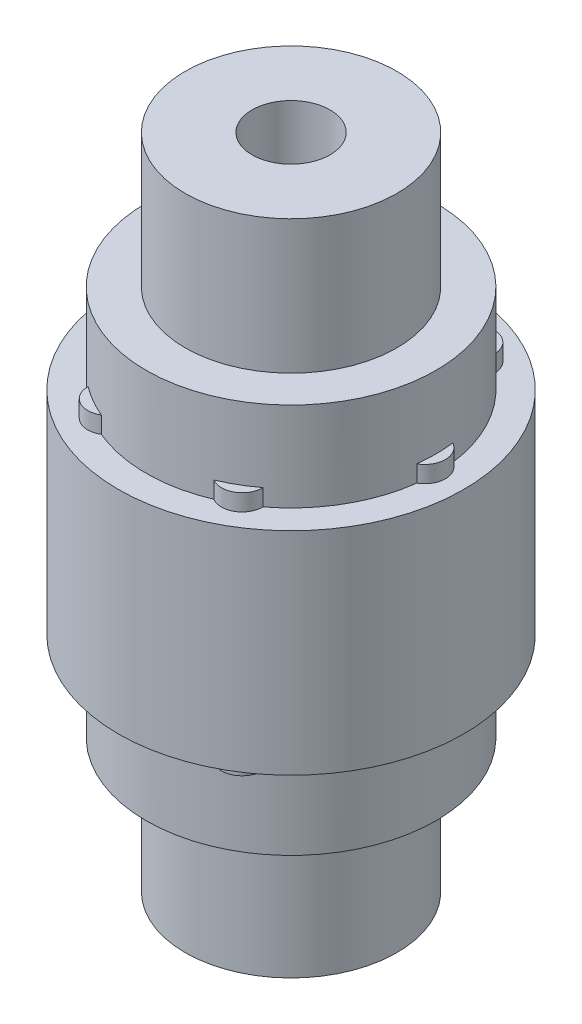
ISO-10303-21;
HEADER;
FILE_DESCRIPTION(('STEP AP214'),'2;1');
FILE_NAME('part.step','',(''),(''),'','','');
FILE_SCHEMA(('AUTOMOTIVE_DESIGN { 1 0 10303 214 1 1 1 1 }'));
ENDSEC;
DATA;
#1=APPLICATION_CONTEXT('core data for automotive mechanical design processes');
#2=APPLICATION_PROTOCOL_DEFINITION('international standard','automotive_design',2000,#1);
#3=PRODUCT_CONTEXT('',#1,'mechanical');
#4=PRODUCT('Part','Part','',(#3));
#5=PRODUCT_RELATED_PRODUCT_CATEGORY('part','',(#4));
#6=PRODUCT_DEFINITION_FORMATION('','',#4);
#7=PRODUCT_DEFINITION_CONTEXT('part definition',#1,'design');
#8=PRODUCT_DEFINITION('design','',#6,#7);
#9=PRODUCT_DEFINITION_SHAPE('','',#8);
#10=(LENGTH_UNIT() NAMED_UNIT(*) SI_UNIT(.MILLI.,.METRE.));
#11=(NAMED_UNIT(*) PLANE_ANGLE_UNIT() SI_UNIT($,.RADIAN.));
#12=(NAMED_UNIT(*) SI_UNIT($,.STERADIAN.) SOLID_ANGLE_UNIT());
#13=UNCERTAINTY_MEASURE_WITH_UNIT(LENGTH_MEASURE(1.E-05),#10,'distance_accuracy_value','');
#14=(GEOMETRIC_REPRESENTATION_CONTEXT(3) GLOBAL_UNCERTAINTY_ASSIGNED_CONTEXT((#13)) GLOBAL_UNIT_ASSIGNED_CONTEXT((#10,
#11,#12)) REPRESENTATION_CONTEXT('',''));
#15=CARTESIAN_POINT('',(0.,0.,0.));
#16=DIRECTION('',(0.,0.,1.));
#17=DIRECTION('',(1.,0.,0.));
#18=AXIS2_PLACEMENT_3D('',#15,#16,#17);
#19=CARTESIAN_POINT('',(0.,35.,0.));
#20=DIRECTION('',(0.,-1.,0.));
#21=DIRECTION('',(0.,0.,-1.));
#22=AXIS2_PLACEMENT_3D('',#19,#20,#21);
#23=CYLINDRICAL_SURFACE('',#22,26.);
#24=CARTESIAN_POINT('',(0.,-35.,0.));
#25=DIRECTION('',(0.,1.,0.));
#26=DIRECTION('',(0.,0.,1.));
#27=AXIS2_PLACEMENT_3D('',#24,#25,#26);
#28=CIRCLE('',#27,26.);
#29=CARTESIAN_POINT('',(0.,-35.,26.));
#30=VERTEX_POINT('',#29);
#31=EDGE_CURVE('E300',#30,#30,#28,.T.);
#32=ORIENTED_EDGE('',*,*,#31,.T.);
#33=EDGE_LOOP('',(#32));
#34=FACE_BOUND('',#33,.T.);
#35=DIRECTION('',(0.,-1.,0.));
#36=VECTOR('',#35,1.);
#37=CARTESIAN_POINT('',(10.0986054188646,0.,23.9586762696539));
#38=LINE('',#37,#36);
#39=CARTESIAN_POINT('',(10.0986054188646,-19.,23.9586762696539));
#40=VERTEX_POINT('',#39);
#41=CARTESIAN_POINT('',(10.0986054188646,-22.,23.9586762696539));
#42=VERTEX_POINT('',#41);
#43=EDGE_CURVE('E401',#40,#42,#38,.T.);
#44=ORIENTED_EDGE('',*,*,#43,.F.);
#45=CARTESIAN_POINT('',(0.,-19.,0.));
#46=DIRECTION('',(0.,1.,0.));
#47=DIRECTION('',(0.,0.,1.));
#48=AXIS2_PLACEMENT_3D('',#45,#46,#47);
#49=CIRCLE('',#48,26.);
#50=CARTESIAN_POINT('',(-10.0986054188647,-19.,23.9586762696539));
#51=VERTEX_POINT('',#50);
#52=EDGE_CURVE('E278',#40,#51,#49,.F.);
#53=ORIENTED_EDGE('',*,*,#52,.T.);
#54=DIRECTION('',(0.,-1.,0.));
#55=VECTOR('',#54,1.);
#56=CARTESIAN_POINT('',(-10.0986054188646,0.,23.9586762696539));
#57=LINE('',#56,#55);
#58=CARTESIAN_POINT('',(-10.0986054188646,-22.,23.9586762696539));
#59=VERTEX_POINT('',#58);
#60=EDGE_CURVE('E390',#59,#51,#57,.F.);
#61=ORIENTED_EDGE('',*,*,#60,.F.);
#62=CARTESIAN_POINT('',(0.,-22.,0.));
#63=DIRECTION('',(0.,1.,0.));
#64=DIRECTION('',(0.,0.,1.));
#65=AXIS2_PLACEMENT_3D('',#62,#63,#64);
#66=CIRCLE('',#65,26.);
#67=CARTESIAN_POINT('',(-15.6995195811354,-22.,20.7249869703589));
#68=VERTEX_POINT('',#67);
#69=EDGE_CURVE('E219',#68,#59,#66,.T.);
#70=ORIENTED_EDGE('',*,*,#69,.F.);
#71=DIRECTION('',(0.,-1.,0.));
#72=VECTOR('',#71,1.);
#73=CARTESIAN_POINT('',(-15.6995195811354,0.,20.7249869703589));
#74=LINE('',#73,#72);
#75=CARTESIAN_POINT('',(-15.6995195811354,-19.,20.7249869703589));
#76=VERTEX_POINT('',#75);
#77=EDGE_CURVE('E387',#76,#68,#74,.T.);
#78=ORIENTED_EDGE('',*,*,#77,.F.);
#79=CARTESIAN_POINT('',(-25.798125,-19.,3.23368929929499));
#80=VERTEX_POINT('',#79);
#81=EDGE_CURVE('E792',#76,#80,#49,.F.);
#82=ORIENTED_EDGE('',*,*,#81,.T.);
#83=DIRECTION('',(0.,-1.,0.));
#84=VECTOR('',#83,1.);
#85=CARTESIAN_POINT('',(-25.798125,0.,3.233689299295));
#86=LINE('',#85,#84);
#87=CARTESIAN_POINT('',(-25.798125,-22.,3.233689299295));
#88=VERTEX_POINT('',#87);
#89=EDGE_CURVE('E371',#88,#80,#86,.F.);
#90=ORIENTED_EDGE('',*,*,#89,.F.);
#91=CARTESIAN_POINT('',(0.,-22.,0.));
#92=DIRECTION('',(0.,1.,0.));
#93=DIRECTION('',(0.,0.,1.));
#94=AXIS2_PLACEMENT_3D('',#91,#92,#93);
#95=CIRCLE('',#94,26.);
#96=CARTESIAN_POINT('',(-25.798125,-22.,-3.233689299295));
#97=VERTEX_POINT('',#96);
#98=EDGE_CURVE('E230',#97,#88,#95,.T.);
#99=ORIENTED_EDGE('',*,*,#98,.F.);
#100=DIRECTION('',(0.,-1.,0.));
#101=VECTOR('',#100,1.);
#102=CARTESIAN_POINT('',(-25.798125,0.,-3.233689299295));
#103=LINE('',#102,#101);
#104=CARTESIAN_POINT('',(-25.798125,-19.,-3.23368929929499));
#105=VERTEX_POINT('',#104);
#106=EDGE_CURVE('E368',#105,#97,#103,.T.);
#107=ORIENTED_EDGE('',*,*,#106,.F.);
#108=CARTESIAN_POINT('',(-15.6995195811354,-19.,-20.7249869703589));
#109=VERTEX_POINT('',#108);
#110=EDGE_CURVE('E794',#105,#109,#49,.F.);
#111=ORIENTED_EDGE('',*,*,#110,.T.);
#112=DIRECTION('',(0.,-1.,0.));
#113=VECTOR('',#112,1.);
#114=CARTESIAN_POINT('',(-15.6995195811354,0.,-20.7249869703589));
#115=LINE('',#114,#113);
#116=CARTESIAN_POINT('',(-15.6995195811354,-22.,-20.7249869703589));
#117=VERTEX_POINT('',#116);
#118=EDGE_CURVE('E352',#117,#109,#115,.F.);
#119=ORIENTED_EDGE('',*,*,#118,.F.);
#120=CARTESIAN_POINT('',(0.,-22.,0.));
#121=DIRECTION('',(0.,1.,0.));
#122=DIRECTION('',(0.,0.,1.));
#123=AXIS2_PLACEMENT_3D('',#120,#121,#122);
#124=CIRCLE('',#123,26.);
#125=CARTESIAN_POINT('',(-10.0986054188646,-22.,-23.9586762696539));
#126=VERTEX_POINT('',#125);
#127=EDGE_CURVE('E239',#126,#117,#124,.T.);
#128=ORIENTED_EDGE('',*,*,#127,.F.);
#129=DIRECTION('',(0.,-1.,0.));
#130=VECTOR('',#129,1.);
#131=CARTESIAN_POINT('',(-10.0986054188646,0.,-23.9586762696539));
#132=LINE('',#131,#130);
#133=CARTESIAN_POINT('',(-10.0986054188646,-19.,-23.9586762696539));
#134=VERTEX_POINT('',#133);
#135=EDGE_CURVE('E349',#134,#126,#132,.T.);
#136=ORIENTED_EDGE('',*,*,#135,.F.);
#137=CARTESIAN_POINT('',(10.0986054188646,-19.,-23.9586762696539));
#138=VERTEX_POINT('',#137);
#139=EDGE_CURVE('E795',#134,#138,#49,.F.);
#140=ORIENTED_EDGE('',*,*,#139,.T.);
#141=DIRECTION('',(0.,-1.,0.));
#142=VECTOR('',#141,1.);
#143=CARTESIAN_POINT('',(10.0986054188646,0.,-23.9586762696539));
#144=LINE('',#143,#142);
#145=CARTESIAN_POINT('',(10.0986054188646,-22.,-23.9586762696539));
#146=VERTEX_POINT('',#145);
#147=EDGE_CURVE('E333',#146,#138,#144,.F.);
#148=ORIENTED_EDGE('',*,*,#147,.F.);
#149=CARTESIAN_POINT('',(0.,-22.,0.));
#150=DIRECTION('',(0.,1.,0.));
#151=DIRECTION('',(0.,0.,1.));
#152=AXIS2_PLACEMENT_3D('',#149,#150,#151);
#153=CIRCLE('',#152,26.);
#154=CARTESIAN_POINT('',(15.6995195811354,-22.,-20.7249869703589));
#155=VERTEX_POINT('',#154);
#156=EDGE_CURVE('E248',#155,#146,#153,.T.);
#157=ORIENTED_EDGE('',*,*,#156,.F.);
#158=DIRECTION('',(0.,-1.,0.));
#159=VECTOR('',#158,1.);
#160=CARTESIAN_POINT('',(15.6995195811354,0.,-20.7249869703589));
#161=LINE('',#160,#159);
#162=CARTESIAN_POINT('',(15.6995195811354,-19.,-20.7249869703589));
#163=VERTEX_POINT('',#162);
#164=EDGE_CURVE('E330',#163,#155,#161,.T.);
#165=ORIENTED_EDGE('',*,*,#164,.F.);
#166=CARTESIAN_POINT('',(25.798125,-19.,-3.23368929929499));
#167=VERTEX_POINT('',#166);
#168=EDGE_CURVE('E279',#163,#167,#49,.F.);
#169=ORIENTED_EDGE('',*,*,#168,.T.);
#170=DIRECTION('',(0.,-1.,0.));
#171=VECTOR('',#170,1.);
#172=CARTESIAN_POINT('',(25.798125,0.,-3.233689299295));
#173=LINE('',#172,#171);
#174=CARTESIAN_POINT('',(25.798125,-22.,-3.233689299295));
#175=VERTEX_POINT('',#174);
#176=EDGE_CURVE('E309',#175,#167,#173,.F.);
#177=ORIENTED_EDGE('',*,*,#176,.F.);
#178=CARTESIAN_POINT('',(0.,-22.,0.));
#179=DIRECTION('',(0.,1.,0.));
#180=DIRECTION('',(0.,0.,1.));
#181=AXIS2_PLACEMENT_3D('',#178,#179,#180);
#182=CIRCLE('',#181,26.);
#183=CARTESIAN_POINT('',(25.798125,-22.,3.233689299295));
#184=VERTEX_POINT('',#183);
#185=EDGE_CURVE('E257',#184,#175,#182,.T.);
#186=ORIENTED_EDGE('',*,*,#185,.F.);
#187=DIRECTION('',(0.,-1.,0.));
#188=VECTOR('',#187,1.);
#189=CARTESIAN_POINT('',(25.798125,0.,3.233689299295));
#190=LINE('',#189,#188);
#191=CARTESIAN_POINT('',(25.798125,-19.,3.23368929929499));
#192=VERTEX_POINT('',#191);
#193=EDGE_CURVE('E304',#192,#184,#190,.T.);
#194=ORIENTED_EDGE('',*,*,#193,.F.);
#195=CARTESIAN_POINT('',(15.6995195811354,-19.,20.7249869703589));
#196=VERTEX_POINT('',#195);
#197=EDGE_CURVE('E271',#192,#196,#49,.F.);
#198=ORIENTED_EDGE('',*,*,#197,.T.);
#199=DIRECTION('',(0.,-1.,0.));
#200=VECTOR('',#199,1.);
#201=CARTESIAN_POINT('',(15.6995195811354,0.,20.7249869703589));
#202=LINE('',#201,#200);
#203=CARTESIAN_POINT('',(15.6995195811354,-22.,20.7249869703589));
#204=VERTEX_POINT('',#203);
#205=EDGE_CURVE('E54',#204,#196,#202,.F.);
#206=ORIENTED_EDGE('',*,*,#205,.F.);
#207=CARTESIAN_POINT('',(0.,-22.,0.));
#208=DIRECTION('',(0.,1.,0.));
#209=DIRECTION('',(0.,0.,1.));
#210=AXIS2_PLACEMENT_3D('',#207,#208,#209);
#211=CIRCLE('',#210,26.);
#212=EDGE_CURVE('E11',#42,#204,#211,.T.);
#213=ORIENTED_EDGE('',*,*,#212,.F.);
#214=EDGE_LOOP('',(#44,#53,#61,#70,#78,#82,#90,#99,#107,#111,#119,#128,#136,#140,#148,#157,#165,
#169,#177,#186,#194,#198,#206,#213));
#215=FACE_BOUND('',#214,.T.);
#216=ADVANCED_FACE('F39',(#34,#215),#23,.T.);
#217=CARTESIAN_POINT('',(0.,35.,0.));
#218=DIRECTION('',(0.,1.,0.));
#219=DIRECTION('',(0.,0.,1.));
#220=AXIS2_PLACEMENT_3D('',#217,#218,#219);
#221=CIRCLE('',#220,26.);
#222=CARTESIAN_POINT('',(0.,35.,26.));
#223=VERTEX_POINT('',#222);
#224=EDGE_CURVE('E303',#223,#223,#221,.T.);
#225=ORIENTED_EDGE('',*,*,#224,.F.);
#226=EDGE_LOOP('',(#225));
#227=FACE_BOUND('',#226,.T.);
#228=DIRECTION('',(0.,-1.,0.));
#229=VECTOR('',#228,1.);
#230=CARTESIAN_POINT('',(10.0986054188646,0.,23.9586762696539));
#231=LINE('',#230,#229);
#232=CARTESIAN_POINT('',(10.0986054188646,22.,23.9586762696539));
#233=VERTEX_POINT('',#232);
#234=CARTESIAN_POINT('',(10.0986054188646,19.,23.9586762696539));
#235=VERTEX_POINT('',#234);
#236=EDGE_CURVE('E209',#233,#235,#231,.T.);
#237=ORIENTED_EDGE('',*,*,#236,.F.);
#238=CARTESIAN_POINT('',(0.,22.,0.));
#239=DIRECTION('',(0.,1.,0.));
#240=DIRECTION('',(0.,0.,1.));
#241=AXIS2_PLACEMENT_3D('',#238,#239,#240);
#242=CIRCLE('',#241,26.);
#243=CARTESIAN_POINT('',(15.6995195811354,22.,20.7249869703589));
#244=VERTEX_POINT('',#243);
#245=EDGE_CURVE('E47',#233,#244,#242,.T.);
#246=ORIENTED_EDGE('',*,*,#245,.T.);
#247=DIRECTION('',(0.,-1.,0.));
#248=VECTOR('',#247,1.);
#249=CARTESIAN_POINT('',(15.6995195811354,0.,20.7249869703589));
#250=LINE('',#249,#248);
#251=CARTESIAN_POINT('',(15.6995195811354,19.,20.7249869703589));
#252=VERTEX_POINT('',#251);
#253=EDGE_CURVE('E198',#252,#244,#250,.F.);
#254=ORIENTED_EDGE('',*,*,#253,.F.);
#255=CARTESIAN_POINT('',(0.,19.,0.));
#256=DIRECTION('',(0.,1.,0.));
#257=DIRECTION('',(0.,0.,1.));
#258=AXIS2_PLACEMENT_3D('',#255,#256,#257);
#259=CIRCLE('',#258,26.);
#260=CARTESIAN_POINT('',(25.798125,19.,3.23368929929499));
#261=VERTEX_POINT('',#260);
#262=EDGE_CURVE('E276',#261,#252,#259,.F.);
#263=ORIENTED_EDGE('',*,*,#262,.F.);
#264=DIRECTION('',(0.,-1.,0.));
#265=VECTOR('',#264,1.);
#266=CARTESIAN_POINT('',(25.798125,0.,3.233689299295));
#267=LINE('',#266,#265);
#268=CARTESIAN_POINT('',(25.798125,22.,3.233689299295));
#269=VERTEX_POINT('',#268);
#270=EDGE_CURVE('E260',#269,#261,#267,.T.);
#271=ORIENTED_EDGE('',*,*,#270,.F.);
#272=CARTESIAN_POINT('',(0.,22.,0.));
#273=DIRECTION('',(0.,1.,0.));
#274=DIRECTION('',(0.,0.,1.));
#275=AXIS2_PLACEMENT_3D('',#272,#273,#274);
#276=CIRCLE('',#275,26.);
#277=CARTESIAN_POINT('',(25.798125,22.,-3.233689299295));
#278=VERTEX_POINT('',#277);
#279=EDGE_CURVE('E265',#269,#278,#276,.T.);
#280=ORIENTED_EDGE('',*,*,#279,.T.);
#281=DIRECTION('',(0.,-1.,0.));
#282=VECTOR('',#281,1.);
#283=CARTESIAN_POINT('',(25.798125,0.,-3.233689299295));
#284=LINE('',#283,#282);
#285=CARTESIAN_POINT('',(25.798125,19.,-3.233689299295));
#286=VERTEX_POINT('',#285);
#287=EDGE_CURVE('E262',#286,#278,#284,.F.);
#288=ORIENTED_EDGE('',*,*,#287,.F.);
#289=CARTESIAN_POINT('',(15.6995195811354,19.,-20.7249869703589));
#290=VERTEX_POINT('',#289);
#291=EDGE_CURVE('E299',#290,#286,#259,.F.);
#292=ORIENTED_EDGE('',*,*,#291,.F.);
#293=DIRECTION('',(0.,-1.,0.));
#294=VECTOR('',#293,1.);
#295=CARTESIAN_POINT('',(15.6995195811354,0.,-20.7249869703589));
#296=LINE('',#295,#294);
#297=CARTESIAN_POINT('',(15.6995195811354,22.,-20.7249869703589));
#298=VERTEX_POINT('',#297);
#299=EDGE_CURVE('E322',#298,#290,#296,.T.);
#300=ORIENTED_EDGE('',*,*,#299,.F.);
#301=CARTESIAN_POINT('',(0.,22.,0.));
#302=DIRECTION('',(0.,1.,0.));
#303=DIRECTION('',(0.,0.,1.));
#304=AXIS2_PLACEMENT_3D('',#301,#302,#303);
#305=CIRCLE('',#304,26.);
#306=CARTESIAN_POINT('',(10.0986054188646,22.,-23.9586762696539));
#307=VERTEX_POINT('',#306);
#308=EDGE_CURVE('E251',#298,#307,#305,.T.);
#309=ORIENTED_EDGE('',*,*,#308,.T.);
#310=DIRECTION('',(0.,-1.,0.));
#311=VECTOR('',#310,1.);
#312=CARTESIAN_POINT('',(10.0986054188646,0.,-23.9586762696539));
#313=LINE('',#312,#311);
#314=CARTESIAN_POINT('',(10.0986054188646,19.,-23.9586762696539));
#315=VERTEX_POINT('',#314);
#316=EDGE_CURVE('E325',#315,#307,#313,.F.);
#317=ORIENTED_EDGE('',*,*,#316,.F.);
#318=CARTESIAN_POINT('',(-10.0986054188646,19.,-23.9586762696539));
#319=VERTEX_POINT('',#318);
#320=EDGE_CURVE('E766',#319,#315,#259,.F.);
#321=ORIENTED_EDGE('',*,*,#320,.F.);
#322=DIRECTION('',(0.,-1.,0.));
#323=VECTOR('',#322,1.);
#324=CARTESIAN_POINT('',(-10.0986054188646,0.,-23.9586762696539));
#325=LINE('',#324,#323);
#326=CARTESIAN_POINT('',(-10.0986054188646,22.,-23.9586762696539));
#327=VERTEX_POINT('',#326);
#328=EDGE_CURVE('E340',#327,#319,#325,.T.);
#329=ORIENTED_EDGE('',*,*,#328,.F.);
#330=CARTESIAN_POINT('',(0.,22.,0.));
#331=DIRECTION('',(0.,1.,0.));
#332=DIRECTION('',(0.,0.,1.));
#333=AXIS2_PLACEMENT_3D('',#330,#331,#332);
#334=CIRCLE('',#333,26.);
#335=CARTESIAN_POINT('',(-15.6995195811354,22.,-20.7249869703589));
#336=VERTEX_POINT('',#335);
#337=EDGE_CURVE('E242',#327,#336,#334,.T.);
#338=ORIENTED_EDGE('',*,*,#337,.T.);
#339=DIRECTION('',(0.,-1.,0.));
#340=VECTOR('',#339,1.);
#341=CARTESIAN_POINT('',(-15.6995195811354,0.,-20.7249869703589));
#342=LINE('',#341,#340);
#343=CARTESIAN_POINT('',(-15.6995195811354,19.,-20.7249869703589));
#344=VERTEX_POINT('',#343);
#345=EDGE_CURVE('E344',#344,#336,#342,.F.);
#346=ORIENTED_EDGE('',*,*,#345,.F.);
#347=CARTESIAN_POINT('',(-25.798125,19.,-3.23368929929499));
#348=VERTEX_POINT('',#347);
#349=EDGE_CURVE('E765',#348,#344,#259,.F.);
#350=ORIENTED_EDGE('',*,*,#349,.F.);
#351=DIRECTION('',(0.,-1.,0.));
#352=VECTOR('',#351,1.);
#353=CARTESIAN_POINT('',(-25.798125,0.,-3.233689299295));
#354=LINE('',#353,#352);
#355=CARTESIAN_POINT('',(-25.798125,22.,-3.233689299295));
#356=VERTEX_POINT('',#355);
#357=EDGE_CURVE('E359',#356,#348,#354,.T.);
#358=ORIENTED_EDGE('',*,*,#357,.F.);
#359=CARTESIAN_POINT('',(0.,22.,0.));
#360=DIRECTION('',(0.,1.,0.));
#361=DIRECTION('',(0.,0.,1.));
#362=AXIS2_PLACEMENT_3D('',#359,#360,#361);
#363=CIRCLE('',#362,26.);
#364=CARTESIAN_POINT('',(-25.798125,22.,3.233689299295));
#365=VERTEX_POINT('',#364);
#366=EDGE_CURVE('E233',#356,#365,#363,.T.);
#367=ORIENTED_EDGE('',*,*,#366,.T.);
#368=DIRECTION('',(0.,-1.,0.));
#369=VECTOR('',#368,1.);
#370=CARTESIAN_POINT('',(-25.798125,0.,3.233689299295));
#371=LINE('',#370,#369);
#372=CARTESIAN_POINT('',(-25.798125,19.,3.23368929929499));
#373=VERTEX_POINT('',#372);
#374=EDGE_CURVE('E363',#373,#365,#371,.F.);
#375=ORIENTED_EDGE('',*,*,#374,.F.);
#376=CARTESIAN_POINT('',(-15.6995195811354,19.,20.7249869703589));
#377=VERTEX_POINT('',#376);
#378=EDGE_CURVE('E763',#377,#373,#259,.F.);
#379=ORIENTED_EDGE('',*,*,#378,.F.);
#380=DIRECTION('',(0.,-1.,0.));
#381=VECTOR('',#380,1.);
#382=CARTESIAN_POINT('',(-15.6995195811354,0.,20.7249869703589));
#383=LINE('',#382,#381);
#384=CARTESIAN_POINT('',(-15.6995195811354,22.,20.7249869703589));
#385=VERTEX_POINT('',#384);
#386=EDGE_CURVE('E378',#385,#377,#383,.T.);
#387=ORIENTED_EDGE('',*,*,#386,.F.);
#388=CARTESIAN_POINT('',(0.,22.,0.));
#389=DIRECTION('',(0.,1.,0.));
#390=DIRECTION('',(0.,0.,1.));
#391=AXIS2_PLACEMENT_3D('',#388,#389,#390);
#392=CIRCLE('',#391,26.);
#393=CARTESIAN_POINT('',(-10.0986054188646,22.,23.9586762696539));
#394=VERTEX_POINT('',#393);
#395=EDGE_CURVE('E224',#385,#394,#392,.T.);
#396=ORIENTED_EDGE('',*,*,#395,.T.);
#397=DIRECTION('',(0.,-1.,0.));
#398=VECTOR('',#397,1.);
#399=CARTESIAN_POINT('',(-10.0986054188646,0.,23.9586762696539));
#400=LINE('',#399,#398);
#401=CARTESIAN_POINT('',(-10.0986054188647,19.,23.9586762696539));
#402=VERTEX_POINT('',#401);
#403=EDGE_CURVE('E382',#402,#394,#400,.F.);
#404=ORIENTED_EDGE('',*,*,#403,.F.);
#405=EDGE_CURVE('E298',#235,#402,#259,.F.);
#406=ORIENTED_EDGE('',*,*,#405,.F.);
#407=EDGE_LOOP('',(#237,#246,#254,#263,#271,#280,#288,#292,#300,#309,#317,#321,#329,#338,#346,
#350,#358,#367,#375,#379,#387,#396,#404,#406));
#408=FACE_BOUND('',#407,.T.);
#409=ADVANCED_FACE('F215',(#227,#408),#23,.T.);
#410=CARTESIAN_POINT('',(0.,59.,0.));
#411=DIRECTION('',(0.,-1.,0.));
#412=DIRECTION('',(0.,0.,-1.));
#413=AXIS2_PLACEMENT_3D('',#410,#411,#412);
#414=CYLINDRICAL_SURFACE('',#413,19.);
#415=CARTESIAN_POINT('',(0.,-59.,0.));
#416=DIRECTION('',(0.,1.,0.));
#417=DIRECTION('',(0.,0.,1.));
#418=AXIS2_PLACEMENT_3D('',#415,#416,#417);
#419=CIRCLE('',#418,19.);
#420=CARTESIAN_POINT('',(0.,-59.,19.));
#421=VERTEX_POINT('',#420);
#422=EDGE_CURVE('E280',#421,#421,#419,.T.);
#423=ORIENTED_EDGE('',*,*,#422,.T.);
#424=EDGE_LOOP('',(#423));
#425=FACE_BOUND('',#424,.T.);
#426=CARTESIAN_POINT('',(0.,-35.,0.));
#427=DIRECTION('',(0.,1.,0.));
#428=DIRECTION('',(0.,0.,1.));
#429=AXIS2_PLACEMENT_3D('',#426,#427,#428);
#430=CIRCLE('',#429,19.);
#431=CARTESIAN_POINT('',(0.,-35.,19.));
#432=VERTEX_POINT('',#431);
#433=EDGE_CURVE('E268',#432,#432,#430,.T.);
#434=ORIENTED_EDGE('',*,*,#433,.F.);
#435=EDGE_LOOP('',(#434));
#436=FACE_BOUND('',#435,.T.);
#437=ADVANCED_FACE('F426',(#425,#436),#414,.T.);
#438=CARTESIAN_POINT('',(0.,59.,0.));
#439=DIRECTION('',(0.,1.,0.));
#440=DIRECTION('',(0.,0.,1.));
#441=AXIS2_PLACEMENT_3D('',#438,#439,#440);
#442=PLANE('',#441);
#443=CARTESIAN_POINT('',(0.,59.,0.));
#444=DIRECTION('',(0.,1.,0.));
#445=DIRECTION('',(0.,0.,1.));
#446=AXIS2_PLACEMENT_3D('',#443,#444,#445);
#447=CIRCLE('',#446,19.);
#448=CARTESIAN_POINT('',(0.,59.,19.));
#449=VERTEX_POINT('',#448);
#450=EDGE_CURVE('E283',#449,#449,#447,.T.);
#451=ORIENTED_EDGE('',*,*,#450,.T.);
#452=EDGE_LOOP('',(#451));
#453=FACE_BOUND('',#452,.T.);
#454=CARTESIAN_POINT('',(0.,59.,0.));
#455=DIRECTION('',(0.,1.,0.));
#456=DIRECTION('',(0.,0.,1.));
#457=AXIS2_PLACEMENT_3D('',#454,#455,#456);
#458=CIRCLE('',#457,7.);
#459=CARTESIAN_POINT('',(0.,59.,7.));
#460=VERTEX_POINT('',#459);
#461=EDGE_CURVE('E284',#460,#460,#458,.T.);
#462=ORIENTED_EDGE('',*,*,#461,.F.);
#463=EDGE_LOOP('',(#462));
#464=FACE_BOUND('',#463,.T.);
#465=ADVANCED_FACE('F449',(#453,#464),#442,.T.);
#466=CARTESIAN_POINT('',(0.,-59.,0.));
#467=DIRECTION('',(0.,1.,0.));
#468=DIRECTION('',(0.,0.,1.));
#469=AXIS2_PLACEMENT_3D('',#466,#467,#468);
#470=PLANE('',#469);
#471=ORIENTED_EDGE('',*,*,#422,.F.);
#472=EDGE_LOOP('',(#471));
#473=FACE_BOUND('',#472,.T.);
#474=CARTESIAN_POINT('',(0.,-59.,0.));
#475=DIRECTION('',(0.,1.,0.));
#476=DIRECTION('',(0.,0.,1.));
#477=AXIS2_PLACEMENT_3D('',#474,#475,#476);
#478=CIRCLE('',#477,7.);
#479=CARTESIAN_POINT('',(0.,-59.,7.));
#480=VERTEX_POINT('',#479);
#481=EDGE_CURVE('E287',#480,#480,#478,.T.);
#482=ORIENTED_EDGE('',*,*,#481,.T.);
#483=EDGE_LOOP('',(#482));
#484=FACE_BOUND('',#483,.T.);
#485=ADVANCED_FACE('F451',(#473,#484),#470,.F.);
#486=CARTESIAN_POINT('',(0.,35.,0.));
#487=DIRECTION('',(0.,1.,0.));
#488=DIRECTION('',(0.,0.,1.));
#489=AXIS2_PLACEMENT_3D('',#486,#487,#488);
#490=CIRCLE('',#489,19.);
#491=CARTESIAN_POINT('',(0.,35.,19.));
#492=VERTEX_POINT('',#491);
#493=EDGE_CURVE('E272',#492,#492,#490,.T.);
#494=ORIENTED_EDGE('',*,*,#493,.T.);
#495=EDGE_LOOP('',(#494));
#496=FACE_BOUND('',#495,.T.);
#497=ORIENTED_EDGE('',*,*,#450,.F.);
#498=EDGE_LOOP('',(#497));
#499=FACE_BOUND('',#498,.T.);
#500=ADVANCED_FACE('F41',(#496,#499),#414,.T.);
#501=CARTESIAN_POINT('',(0.,59.,0.));
#502=DIRECTION('',(0.,-1.,0.));
#503=DIRECTION('',(0.,0.,-1.));
#504=AXIS2_PLACEMENT_3D('',#501,#502,#503);
#505=CYLINDRICAL_SURFACE('',#504,7.);
#506=ORIENTED_EDGE('',*,*,#461,.T.);
#507=EDGE_LOOP('',(#506));
#508=FACE_BOUND('',#507,.T.);
#509=ORIENTED_EDGE('',*,*,#481,.F.);
#510=EDGE_LOOP('',(#509));
#511=FACE_BOUND('',#510,.T.);
#512=ADVANCED_FACE('F445',(#508,#511),#505,.F.);
#513=CARTESIAN_POINT('',(0.,-35.,0.));
#514=DIRECTION('',(0.,1.,0.));
#515=DIRECTION('',(0.,0.,1.));
#516=AXIS2_PLACEMENT_3D('',#513,#514,#515);
#517=PLANE('',#516);
#518=ORIENTED_EDGE('',*,*,#433,.T.);
#519=EDGE_LOOP('',(#518));
#520=FACE_BOUND('',#519,.T.);
#521=ORIENTED_EDGE('',*,*,#31,.F.);
#522=EDGE_LOOP('',(#521));
#523=FACE_BOUND('',#522,.T.);
#524=ADVANCED_FACE('F430',(#520,#523),#517,.F.);
#525=CARTESIAN_POINT('',(0.,19.,0.));
#526=DIRECTION('',(0.,1.,0.));
#527=DIRECTION('',(0.,0.,1.));
#528=AXIS2_PLACEMENT_3D('',#525,#526,#527);
#529=PLANE('',#528);
#530=ORIENTED_EDGE('',*,*,#262,.T.);
#531=CARTESIAN_POINT('',(12.,19.,20.7846096908265));
#532=DIRECTION('',(0.,1.,0.));
#533=DIRECTION('',(0.,0.,1.));
#534=AXIS2_PLACEMENT_3D('',#531,#532,#533);
#535=CIRCLE('',#534,3.7);
#536=EDGE_CURVE('E204',#252,#235,#535,.F.);
#537=ORIENTED_EDGE('',*,*,#536,.T.);
#538=ORIENTED_EDGE('',*,*,#405,.T.);
#539=CARTESIAN_POINT('',(-12.,19.,20.7846096908265));
#540=DIRECTION('',(0.,1.,0.));
#541=DIRECTION('',(0.,0.,1.));
#542=AXIS2_PLACEMENT_3D('',#539,#540,#541);
#543=CIRCLE('',#542,3.7);
#544=EDGE_CURVE('E384',#402,#377,#543,.F.);
#545=ORIENTED_EDGE('',*,*,#544,.T.);
#546=ORIENTED_EDGE('',*,*,#378,.T.);
#547=CARTESIAN_POINT('',(-24.,19.,0.));
#548=DIRECTION('',(0.,1.,0.));
#549=DIRECTION('',(0.,0.,1.));
#550=AXIS2_PLACEMENT_3D('',#547,#548,#549);
#551=CIRCLE('',#550,3.7);
#552=EDGE_CURVE('E365',#373,#348,#551,.F.);
#553=ORIENTED_EDGE('',*,*,#552,.T.);
#554=ORIENTED_EDGE('',*,*,#349,.T.);
#555=CARTESIAN_POINT('',(-12.,19.,-20.7846096908265));
#556=DIRECTION('',(0.,1.,0.));
#557=DIRECTION('',(0.,0.,1.));
#558=AXIS2_PLACEMENT_3D('',#555,#556,#557);
#559=CIRCLE('',#558,3.7);
#560=EDGE_CURVE('E346',#344,#319,#559,.F.);
#561=ORIENTED_EDGE('',*,*,#560,.T.);
#562=ORIENTED_EDGE('',*,*,#320,.T.);
#563=CARTESIAN_POINT('',(12.,19.,-20.7846096908265));
#564=DIRECTION('',(0.,1.,0.));
#565=DIRECTION('',(0.,0.,1.));
#566=AXIS2_PLACEMENT_3D('',#563,#564,#565);
#567=CIRCLE('',#566,3.7);
#568=EDGE_CURVE('E327',#315,#290,#567,.F.);
#569=ORIENTED_EDGE('',*,*,#568,.T.);
#570=ORIENTED_EDGE('',*,*,#291,.T.);
#571=CARTESIAN_POINT('',(24.,19.,0.));
#572=DIRECTION('',(0.,1.,0.));
#573=DIRECTION('',(0.,0.,1.));
#574=AXIS2_PLACEMENT_3D('',#571,#572,#573);
#575=CIRCLE('',#574,3.7);
#576=EDGE_CURVE('E315',#286,#261,#575,.F.);
#577=ORIENTED_EDGE('',*,*,#576,.T.);
#578=EDGE_LOOP('',(#530,#537,#538,#545,#546,#553,#554,#561,#562,#569,#570,#577));
#579=FACE_BOUND('',#578,.T.);
#580=CARTESIAN_POINT('',(0.,19.,0.));
#581=DIRECTION('',(0.,1.,0.));
#582=DIRECTION('',(0.,0.,1.));
#583=AXIS2_PLACEMENT_3D('',#580,#581,#582);
#584=CIRCLE('',#583,31.);
#585=CARTESIAN_POINT('',(0.,19.,31.));
#586=VERTEX_POINT('',#585);
#587=EDGE_CURVE('E290',#586,#586,#584,.T.);
#588=ORIENTED_EDGE('',*,*,#587,.T.);
#589=EDGE_LOOP('',(#588));
#590=FACE_BOUND('',#589,.T.);
#591=ADVANCED_FACE('F432',(#579,#590),#529,.T.);
#592=CARTESIAN_POINT('',(0.,19.,0.));
#593=DIRECTION('',(0.,-1.,0.));
#594=DIRECTION('',(0.,0.,-1.));
#595=AXIS2_PLACEMENT_3D('',#592,#593,#594);
#596=CYLINDRICAL_SURFACE('',#595,31.);
#597=ORIENTED_EDGE('',*,*,#587,.F.);
#598=EDGE_LOOP('',(#597));
#599=FACE_BOUND('',#598,.T.);
#600=CARTESIAN_POINT('',(0.,-19.,0.));
#601=DIRECTION('',(0.,1.,0.));
#602=DIRECTION('',(0.,0.,1.));
#603=AXIS2_PLACEMENT_3D('',#600,#601,#602);
#604=CIRCLE('',#603,31.);
#605=CARTESIAN_POINT('',(0.,-19.,31.));
#606=VERTEX_POINT('',#605);
#607=EDGE_CURVE('E275',#606,#606,#604,.T.);
#608=ORIENTED_EDGE('',*,*,#607,.T.);
#609=EDGE_LOOP('',(#608));
#610=FACE_BOUND('',#609,.T.);
#611=ADVANCED_FACE('F435',(#599,#610),#596,.T.);
#612=CARTESIAN_POINT('',(0.,-19.,0.));
#613=DIRECTION('',(0.,1.,0.));
#614=DIRECTION('',(0.,0.,1.));
#615=AXIS2_PLACEMENT_3D('',#612,#613,#614);
#616=PLANE('',#615);
#617=CARTESIAN_POINT('',(12.,-19.,20.7846096908265));
#618=DIRECTION('',(0.,1.,0.));
#619=DIRECTION('',(0.,0.,1.));
#620=AXIS2_PLACEMENT_3D('',#617,#618,#619);
#621=CIRCLE('',#620,3.7);
#622=EDGE_CURVE('E217',#196,#40,#621,.F.);
#623=ORIENTED_EDGE('',*,*,#622,.F.);
#624=ORIENTED_EDGE('',*,*,#197,.F.);
#625=CARTESIAN_POINT('',(24.,-19.,0.));
#626=DIRECTION('',(0.,1.,0.));
#627=DIRECTION('',(0.,0.,1.));
#628=AXIS2_PLACEMENT_3D('',#625,#626,#627);
#629=CIRCLE('',#628,3.7);
#630=EDGE_CURVE('E312',#167,#192,#629,.F.);
#631=ORIENTED_EDGE('',*,*,#630,.F.);
#632=ORIENTED_EDGE('',*,*,#168,.F.);
#633=CARTESIAN_POINT('',(12.,-19.,-20.7846096908265));
#634=DIRECTION('',(0.,1.,0.));
#635=DIRECTION('',(0.,0.,1.));
#636=AXIS2_PLACEMENT_3D('',#633,#634,#635);
#637=CIRCLE('',#636,3.7);
#638=EDGE_CURVE('E254',#138,#163,#637,.F.);
#639=ORIENTED_EDGE('',*,*,#638,.F.);
#640=ORIENTED_EDGE('',*,*,#139,.F.);
#641=CARTESIAN_POINT('',(-12.,-19.,-20.7846096908265));
#642=DIRECTION('',(0.,1.,0.));
#643=DIRECTION('',(0.,0.,1.));
#644=AXIS2_PLACEMENT_3D('',#641,#642,#643);
#645=CIRCLE('',#644,3.7);
#646=EDGE_CURVE('E245',#109,#134,#645,.F.);
#647=ORIENTED_EDGE('',*,*,#646,.F.);
#648=ORIENTED_EDGE('',*,*,#110,.F.);
#649=CARTESIAN_POINT('',(-24.,-19.,0.));
#650=DIRECTION('',(0.,1.,0.));
#651=DIRECTION('',(0.,0.,1.));
#652=AXIS2_PLACEMENT_3D('',#649,#650,#651);
#653=CIRCLE('',#652,3.7);
#654=EDGE_CURVE('E236',#80,#105,#653,.F.);
#655=ORIENTED_EDGE('',*,*,#654,.F.);
#656=ORIENTED_EDGE('',*,*,#81,.F.);
#657=CARTESIAN_POINT('',(-12.,-19.,20.7846096908265));
#658=DIRECTION('',(0.,1.,0.));
#659=DIRECTION('',(0.,0.,1.));
#660=AXIS2_PLACEMENT_3D('',#657,#658,#659);
#661=CIRCLE('',#660,3.7);
#662=EDGE_CURVE('E227',#51,#76,#661,.F.);
#663=ORIENTED_EDGE('',*,*,#662,.F.);
#664=ORIENTED_EDGE('',*,*,#52,.F.);
#665=EDGE_LOOP('',(#623,#624,#631,#632,#639,#640,#647,#648,#655,#656,#663,#664));
#666=FACE_BOUND('',#665,.T.);
#667=ORIENTED_EDGE('',*,*,#607,.F.);
#668=EDGE_LOOP('',(#667));
#669=FACE_BOUND('',#668,.T.);
#670=ADVANCED_FACE('F437',(#666,#669),#616,.F.);
#671=CARTESIAN_POINT('',(0.,35.,0.));
#672=DIRECTION('',(0.,1.,0.));
#673=DIRECTION('',(0.,0.,1.));
#674=AXIS2_PLACEMENT_3D('',#671,#672,#673);
#675=PLANE('',#674);
#676=ORIENTED_EDGE('',*,*,#493,.F.);
#677=EDGE_LOOP('',(#676));
#678=FACE_BOUND('',#677,.T.);
#679=ORIENTED_EDGE('',*,*,#224,.T.);
#680=EDGE_LOOP('',(#679));
#681=FACE_BOUND('',#680,.T.);
#682=ADVANCED_FACE('F440',(#678,#681),#675,.T.);
#683=CARTESIAN_POINT('',(24.,22.,0.));
#684=DIRECTION('',(0.,1.,0.));
#685=DIRECTION('',(0.,0.,1.));
#686=AXIS2_PLACEMENT_3D('',#683,#684,#685);
#687=PLANE('',#686);
#688=ORIENTED_EDGE('',*,*,#279,.F.);
#689=CARTESIAN_POINT('',(24.,22.,0.));
#690=DIRECTION('',(0.,1.,0.));
#691=DIRECTION('',(0.,0.,1.));
#692=AXIS2_PLACEMENT_3D('',#689,#690,#691);
#693=CIRCLE('',#692,3.7);
#694=EDGE_CURVE('E318',#269,#278,#693,.T.);
#695=ORIENTED_EDGE('',*,*,#694,.T.);
#696=EDGE_LOOP('',(#688,#695));
#697=FACE_BOUND('',#696,.T.);
#698=ADVANCED_FACE('F483',(#697),#687,.T.);
#699=CARTESIAN_POINT('',(24.,22.,0.));
#700=DIRECTION('',(0.,-1.,0.));
#701=DIRECTION('',(0.,0.,-1.));
#702=AXIS2_PLACEMENT_3D('',#699,#700,#701);
#703=CYLINDRICAL_SURFACE('',#702,3.7);
#704=ORIENTED_EDGE('',*,*,#694,.F.);
#705=ORIENTED_EDGE('',*,*,#270,.T.);
#706=ORIENTED_EDGE('',*,*,#576,.F.);
#707=ORIENTED_EDGE('',*,*,#287,.T.);
#708=EDGE_LOOP('',(#704,#705,#706,#707));
#709=FACE_BOUND('',#708,.T.);
#710=ADVANCED_FACE('F491',(#709),#703,.T.);
#711=ORIENTED_EDGE('',*,*,#630,.T.);
#712=ORIENTED_EDGE('',*,*,#193,.T.);
#713=CARTESIAN_POINT('',(24.,-22.,0.));
#714=DIRECTION('',(0.,1.,0.));
#715=DIRECTION('',(0.,0.,1.));
#716=AXIS2_PLACEMENT_3D('',#713,#714,#715);
#717=CIRCLE('',#716,3.7);
#718=EDGE_CURVE('E319',#184,#175,#717,.T.);
#719=ORIENTED_EDGE('',*,*,#718,.T.);
#720=ORIENTED_EDGE('',*,*,#176,.T.);
#721=EDGE_LOOP('',(#711,#712,#719,#720));
#722=FACE_BOUND('',#721,.T.);
#723=ADVANCED_FACE('F500',(#722),#703,.T.);
#724=CARTESIAN_POINT('',(24.,-22.,0.));
#725=DIRECTION('',(0.,1.,0.));
#726=DIRECTION('',(0.,0.,1.));
#727=AXIS2_PLACEMENT_3D('',#724,#725,#726);
#728=PLANE('',#727);
#729=ORIENTED_EDGE('',*,*,#718,.F.);
#730=ORIENTED_EDGE('',*,*,#185,.T.);
#731=EDGE_LOOP('',(#729,#730));
#732=FACE_BOUND('',#731,.T.);
#733=ADVANCED_FACE('F509',(#732),#728,.F.);
#734=CARTESIAN_POINT('',(12.,22.,-20.7846096908265));
#735=DIRECTION('',(0.,-1.,0.));
#736=DIRECTION('',(0.,0.,-1.));
#737=AXIS2_PLACEMENT_3D('',#734,#735,#736);
#738=CYLINDRICAL_SURFACE('',#737,3.7);
#739=ORIENTED_EDGE('',*,*,#638,.T.);
#740=ORIENTED_EDGE('',*,*,#164,.T.);
#741=CARTESIAN_POINT('',(12.,-22.,-20.7846096908265));
#742=DIRECTION('',(0.,1.,0.));
#743=DIRECTION('',(0.,0.,1.));
#744=AXIS2_PLACEMENT_3D('',#741,#742,#743);
#745=CIRCLE('',#744,3.7);
#746=EDGE_CURVE('E337',#155,#146,#745,.T.);
#747=ORIENTED_EDGE('',*,*,#746,.T.);
#748=ORIENTED_EDGE('',*,*,#147,.T.);
#749=EDGE_LOOP('',(#739,#740,#747,#748));
#750=FACE_BOUND('',#749,.T.);
#751=ADVANCED_FACE('F517',(#750),#738,.T.);
#752=CARTESIAN_POINT('',(12.,-22.,-20.7846096908265));
#753=DIRECTION('',(0.,1.,0.));
#754=DIRECTION('',(0.,0.,1.));
#755=AXIS2_PLACEMENT_3D('',#752,#753,#754);
#756=PLANE('',#755);
#757=ORIENTED_EDGE('',*,*,#746,.F.);
#758=ORIENTED_EDGE('',*,*,#156,.T.);
#759=EDGE_LOOP('',(#757,#758));
#760=FACE_BOUND('',#759,.T.);
#761=ADVANCED_FACE('F526',(#760),#756,.F.);
#762=CARTESIAN_POINT('',(12.,22.,-20.7846096908265));
#763=DIRECTION('',(0.,1.,0.));
#764=DIRECTION('',(0.,0.,1.));
#765=AXIS2_PLACEMENT_3D('',#762,#763,#764);
#766=CIRCLE('',#765,3.7);
#767=EDGE_CURVE('E336',#298,#307,#766,.T.);
#768=ORIENTED_EDGE('',*,*,#767,.F.);
#769=ORIENTED_EDGE('',*,*,#299,.T.);
#770=ORIENTED_EDGE('',*,*,#568,.F.);
#771=ORIENTED_EDGE('',*,*,#316,.T.);
#772=EDGE_LOOP('',(#768,#769,#770,#771));
#773=FACE_BOUND('',#772,.T.);
#774=ADVANCED_FACE('F529',(#773),#738,.T.);
#775=CARTESIAN_POINT('',(12.,22.,-20.7846096908265));
#776=DIRECTION('',(0.,1.,0.));
#777=DIRECTION('',(0.,0.,1.));
#778=AXIS2_PLACEMENT_3D('',#775,#776,#777);
#779=PLANE('',#778);
#780=ORIENTED_EDGE('',*,*,#308,.F.);
#781=ORIENTED_EDGE('',*,*,#767,.T.);
#782=EDGE_LOOP('',(#780,#781));
#783=FACE_BOUND('',#782,.T.);
#784=ADVANCED_FACE('F544',(#783),#779,.T.);
#785=CARTESIAN_POINT('',(-12.,22.,-20.7846096908265));
#786=DIRECTION('',(0.,-1.,0.));
#787=DIRECTION('',(0.,0.,-1.));
#788=AXIS2_PLACEMENT_3D('',#785,#786,#787);
#789=CYLINDRICAL_SURFACE('',#788,3.7);
#790=ORIENTED_EDGE('',*,*,#646,.T.);
#791=ORIENTED_EDGE('',*,*,#135,.T.);
#792=CARTESIAN_POINT('',(-12.,-22.,-20.7846096908265));
#793=DIRECTION('',(0.,1.,0.));
#794=DIRECTION('',(0.,0.,1.));
#795=AXIS2_PLACEMENT_3D('',#792,#793,#794);
#796=CIRCLE('',#795,3.7);
#797=EDGE_CURVE('E356',#126,#117,#796,.T.);
#798=ORIENTED_EDGE('',*,*,#797,.T.);
#799=ORIENTED_EDGE('',*,*,#118,.T.);
#800=EDGE_LOOP('',(#790,#791,#798,#799));
#801=FACE_BOUND('',#800,.T.);
#802=ADVANCED_FACE('F552',(#801),#789,.T.);
#803=CARTESIAN_POINT('',(-12.,-22.,-20.7846096908265));
#804=DIRECTION('',(0.,1.,0.));
#805=DIRECTION('',(0.,0.,1.));
#806=AXIS2_PLACEMENT_3D('',#803,#804,#805);
#807=PLANE('',#806);
#808=ORIENTED_EDGE('',*,*,#797,.F.);
#809=ORIENTED_EDGE('',*,*,#127,.T.);
#810=EDGE_LOOP('',(#808,#809));
#811=FACE_BOUND('',#810,.T.);
#812=ADVANCED_FACE('F561',(#811),#807,.F.);
#813=CARTESIAN_POINT('',(-12.,22.,-20.7846096908265));
#814=DIRECTION('',(0.,1.,0.));
#815=DIRECTION('',(0.,0.,1.));
#816=AXIS2_PLACEMENT_3D('',#813,#814,#815);
#817=CIRCLE('',#816,3.7);
#818=EDGE_CURVE('E355',#327,#336,#817,.T.);
#819=ORIENTED_EDGE('',*,*,#818,.F.);
#820=ORIENTED_EDGE('',*,*,#328,.T.);
#821=ORIENTED_EDGE('',*,*,#560,.F.);
#822=ORIENTED_EDGE('',*,*,#345,.T.);
#823=EDGE_LOOP('',(#819,#820,#821,#822));
#824=FACE_BOUND('',#823,.T.);
#825=ADVANCED_FACE('F564',(#824),#789,.T.);
#826=CARTESIAN_POINT('',(-12.,22.,-20.7846096908265));
#827=DIRECTION('',(0.,1.,0.));
#828=DIRECTION('',(0.,0.,1.));
#829=AXIS2_PLACEMENT_3D('',#826,#827,#828);
#830=PLANE('',#829);
#831=ORIENTED_EDGE('',*,*,#337,.F.);
#832=ORIENTED_EDGE('',*,*,#818,.T.);
#833=EDGE_LOOP('',(#831,#832));
#834=FACE_BOUND('',#833,.T.);
#835=ADVANCED_FACE('F579',(#834),#830,.T.);
#836=CARTESIAN_POINT('',(-24.,22.,0.));
#837=DIRECTION('',(0.,-1.,0.));
#838=DIRECTION('',(0.,0.,-1.));
#839=AXIS2_PLACEMENT_3D('',#836,#837,#838);
#840=CYLINDRICAL_SURFACE('',#839,3.7);
#841=ORIENTED_EDGE('',*,*,#654,.T.);
#842=ORIENTED_EDGE('',*,*,#106,.T.);
#843=CARTESIAN_POINT('',(-24.,-22.,0.));
#844=DIRECTION('',(0.,1.,0.));
#845=DIRECTION('',(0.,0.,1.));
#846=AXIS2_PLACEMENT_3D('',#843,#844,#845);
#847=CIRCLE('',#846,3.7);
#848=EDGE_CURVE('E375',#97,#88,#847,.T.);
#849=ORIENTED_EDGE('',*,*,#848,.T.);
#850=ORIENTED_EDGE('',*,*,#89,.T.);
#851=EDGE_LOOP('',(#841,#842,#849,#850));
#852=FACE_BOUND('',#851,.T.);
#853=ADVANCED_FACE('F587',(#852),#840,.T.);
#854=CARTESIAN_POINT('',(-24.,-22.,0.));
#855=DIRECTION('',(0.,1.,0.));
#856=DIRECTION('',(0.,0.,1.));
#857=AXIS2_PLACEMENT_3D('',#854,#855,#856);
#858=PLANE('',#857);
#859=ORIENTED_EDGE('',*,*,#848,.F.);
#860=ORIENTED_EDGE('',*,*,#98,.T.);
#861=EDGE_LOOP('',(#859,#860));
#862=FACE_BOUND('',#861,.T.);
#863=ADVANCED_FACE('F596',(#862),#858,.F.);
#864=CARTESIAN_POINT('',(-24.,22.,0.));
#865=DIRECTION('',(0.,1.,0.));
#866=DIRECTION('',(0.,0.,1.));
#867=AXIS2_PLACEMENT_3D('',#864,#865,#866);
#868=CIRCLE('',#867,3.7);
#869=EDGE_CURVE('E374',#356,#365,#868,.T.);
#870=ORIENTED_EDGE('',*,*,#869,.F.);
#871=ORIENTED_EDGE('',*,*,#357,.T.);
#872=ORIENTED_EDGE('',*,*,#552,.F.);
#873=ORIENTED_EDGE('',*,*,#374,.T.);
#874=EDGE_LOOP('',(#870,#871,#872,#873));
#875=FACE_BOUND('',#874,.T.);
#876=ADVANCED_FACE('F599',(#875),#840,.T.);
#877=CARTESIAN_POINT('',(-24.,22.,0.));
#878=DIRECTION('',(0.,1.,0.));
#879=DIRECTION('',(0.,0.,1.));
#880=AXIS2_PLACEMENT_3D('',#877,#878,#879);
#881=PLANE('',#880);
#882=ORIENTED_EDGE('',*,*,#366,.F.);
#883=ORIENTED_EDGE('',*,*,#869,.T.);
#884=EDGE_LOOP('',(#882,#883));
#885=FACE_BOUND('',#884,.T.);
#886=ADVANCED_FACE('F614',(#885),#881,.T.);
#887=CARTESIAN_POINT('',(-12.,22.,20.7846096908265));
#888=DIRECTION('',(0.,-1.,0.));
#889=DIRECTION('',(0.,0.,-1.));
#890=AXIS2_PLACEMENT_3D('',#887,#888,#889);
#891=CYLINDRICAL_SURFACE('',#890,3.7);
#892=ORIENTED_EDGE('',*,*,#662,.T.);
#893=ORIENTED_EDGE('',*,*,#77,.T.);
#894=CARTESIAN_POINT('',(-12.,-22.,20.7846096908265));
#895=DIRECTION('',(0.,1.,0.));
#896=DIRECTION('',(0.,0.,1.));
#897=AXIS2_PLACEMENT_3D('',#894,#895,#896);
#898=CIRCLE('',#897,3.7);
#899=EDGE_CURVE('E394',#68,#59,#898,.T.);
#900=ORIENTED_EDGE('',*,*,#899,.T.);
#901=ORIENTED_EDGE('',*,*,#60,.T.);
#902=EDGE_LOOP('',(#892,#893,#900,#901));
#903=FACE_BOUND('',#902,.T.);
#904=ADVANCED_FACE('F622',(#903),#891,.T.);
#905=CARTESIAN_POINT('',(-12.,-22.,20.7846096908265));
#906=DIRECTION('',(0.,1.,0.));
#907=DIRECTION('',(0.,0.,1.));
#908=AXIS2_PLACEMENT_3D('',#905,#906,#907);
#909=PLANE('',#908);
#910=ORIENTED_EDGE('',*,*,#899,.F.);
#911=ORIENTED_EDGE('',*,*,#69,.T.);
#912=EDGE_LOOP('',(#910,#911));
#913=FACE_BOUND('',#912,.T.);
#914=ADVANCED_FACE('F631',(#913),#909,.F.);
#915=CARTESIAN_POINT('',(-12.,22.,20.7846096908265));
#916=DIRECTION('',(0.,1.,0.));
#917=DIRECTION('',(0.,0.,1.));
#918=AXIS2_PLACEMENT_3D('',#915,#916,#917);
#919=CIRCLE('',#918,3.7);
#920=EDGE_CURVE('E393',#385,#394,#919,.T.);
#921=ORIENTED_EDGE('',*,*,#920,.F.);
#922=ORIENTED_EDGE('',*,*,#386,.T.);
#923=ORIENTED_EDGE('',*,*,#544,.F.);
#924=ORIENTED_EDGE('',*,*,#403,.T.);
#925=EDGE_LOOP('',(#921,#922,#923,#924));
#926=FACE_BOUND('',#925,.T.);
#927=ADVANCED_FACE('F634',(#926),#891,.T.);
#928=CARTESIAN_POINT('',(-12.,22.,20.7846096908265));
#929=DIRECTION('',(0.,1.,0.));
#930=DIRECTION('',(0.,0.,1.));
#931=AXIS2_PLACEMENT_3D('',#928,#929,#930);
#932=PLANE('',#931);
#933=ORIENTED_EDGE('',*,*,#395,.F.);
#934=ORIENTED_EDGE('',*,*,#920,.T.);
#935=EDGE_LOOP('',(#933,#934));
#936=FACE_BOUND('',#935,.T.);
#937=ADVANCED_FACE('F417',(#936),#932,.T.);
#938=CARTESIAN_POINT('',(12.,22.,20.7846096908265));
#939=DIRECTION('',(0.,-1.,0.));
#940=DIRECTION('',(0.,0.,-1.));
#941=AXIS2_PLACEMENT_3D('',#938,#939,#940);
#942=CYLINDRICAL_SURFACE('',#941,3.7);
#943=ORIENTED_EDGE('',*,*,#622,.T.);
#944=ORIENTED_EDGE('',*,*,#43,.T.);
#945=CARTESIAN_POINT('',(12.,-22.,20.7846096908265));
#946=DIRECTION('',(0.,1.,0.));
#947=DIRECTION('',(0.,0.,1.));
#948=AXIS2_PLACEMENT_3D('',#945,#946,#947);
#949=CIRCLE('',#948,3.7);
#950=EDGE_CURVE('E213',#42,#204,#949,.T.);
#951=ORIENTED_EDGE('',*,*,#950,.T.);
#952=ORIENTED_EDGE('',*,*,#205,.T.);
#953=EDGE_LOOP('',(#943,#944,#951,#952));
#954=FACE_BOUND('',#953,.T.);
#955=ADVANCED_FACE('F407',(#954),#942,.T.);
#956=CARTESIAN_POINT('',(12.,-22.,20.7846096908265));
#957=DIRECTION('',(0.,1.,0.));
#958=DIRECTION('',(0.,0.,1.));
#959=AXIS2_PLACEMENT_3D('',#956,#957,#958);
#960=PLANE('',#959);
#961=ORIENTED_EDGE('',*,*,#950,.F.);
#962=ORIENTED_EDGE('',*,*,#212,.T.);
#963=EDGE_LOOP('',(#961,#962));
#964=FACE_BOUND('',#963,.T.);
#965=ADVANCED_FACE('F409',(#964),#960,.F.);
#966=CARTESIAN_POINT('',(12.,22.,20.7846096908265));
#967=DIRECTION('',(0.,1.,0.));
#968=DIRECTION('',(0.,0.,1.));
#969=AXIS2_PLACEMENT_3D('',#966,#967,#968);
#970=CIRCLE('',#969,3.7);
#971=EDGE_CURVE('E201',#233,#244,#970,.T.);
#972=ORIENTED_EDGE('',*,*,#971,.F.);
#973=ORIENTED_EDGE('',*,*,#236,.T.);
#974=ORIENTED_EDGE('',*,*,#536,.F.);
#975=ORIENTED_EDGE('',*,*,#253,.T.);
#976=EDGE_LOOP('',(#972,#973,#974,#975));
#977=FACE_BOUND('',#976,.T.);
#978=ADVANCED_FACE('F200',(#977),#942,.T.);
#979=CARTESIAN_POINT('',(12.,22.,20.7846096908265));
#980=DIRECTION('',(0.,1.,0.));
#981=DIRECTION('',(0.,0.,1.));
#982=AXIS2_PLACEMENT_3D('',#979,#980,#981);
#983=PLANE('',#982);
#984=ORIENTED_EDGE('',*,*,#245,.F.);
#985=ORIENTED_EDGE('',*,*,#971,.T.);
#986=EDGE_LOOP('',(#984,#985));
#987=FACE_BOUND('',#986,.T.);
#988=ADVANCED_FACE('F212',(#987),#983,.T.);
#989=CLOSED_SHELL('',(#216,#409,#437,#465,#485,#500,#512,#524,#591,#611,#670,#682,#698,#710,
#723,#733,#751,#761,#774,#784,#802,#812,#825,#835,#853,#863,#876,#886,#904,#914,#927,#937,#955,
#965,#978,#988));
#990=MANIFOLD_SOLID_BREP('B2',#989);
#991=ADVANCED_BREP_SHAPE_REPRESENTATION('',(#18,#990),#14);
#992=SHAPE_DEFINITION_REPRESENTATION(#9,#991);
ENDSEC;
END-ISO-10303-21;
